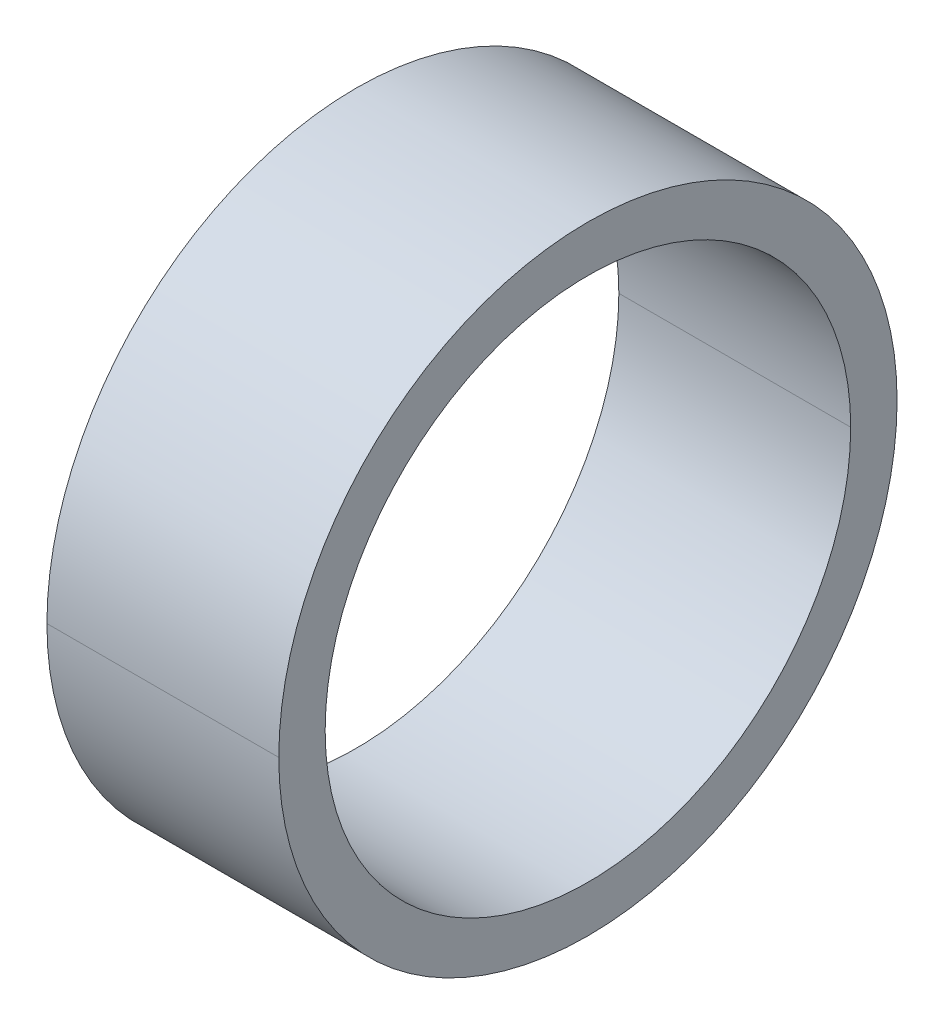
ISO-10303-21;
HEADER;
FILE_DESCRIPTION(('STEP AP214'),'2;1');
FILE_NAME('part.step','',(''),(''),'','','');
FILE_SCHEMA(('AUTOMOTIVE_DESIGN { 1 0 10303 214 1 1 1 1 }'));
ENDSEC;
DATA;
#1=APPLICATION_CONTEXT('core data for automotive mechanical design processes');
#2=APPLICATION_PROTOCOL_DEFINITION('international standard','automotive_design',2000,#1);
#3=PRODUCT_CONTEXT('',#1,'mechanical');
#4=PRODUCT('Part','Part','',(#3));
#5=PRODUCT_RELATED_PRODUCT_CATEGORY('part','',(#4));
#6=PRODUCT_DEFINITION_FORMATION('','',#4);
#7=PRODUCT_DEFINITION_CONTEXT('part definition',#1,'design');
#8=PRODUCT_DEFINITION('design','',#6,#7);
#9=PRODUCT_DEFINITION_SHAPE('','',#8);
#10=(LENGTH_UNIT() NAMED_UNIT(*) SI_UNIT(.MILLI.,.METRE.));
#11=(NAMED_UNIT(*) PLANE_ANGLE_UNIT() SI_UNIT($,.RADIAN.));
#12=(NAMED_UNIT(*) SI_UNIT($,.STERADIAN.) SOLID_ANGLE_UNIT());
#13=UNCERTAINTY_MEASURE_WITH_UNIT(LENGTH_MEASURE(1.E-05),#10,'distance_accuracy_value','');
#14=(GEOMETRIC_REPRESENTATION_CONTEXT(3) GLOBAL_UNCERTAINTY_ASSIGNED_CONTEXT((#13)) GLOBAL_UNIT_ASSIGNED_CONTEXT((#10,
#11,#12)) REPRESENTATION_CONTEXT('',''));
#15=CARTESIAN_POINT('',(0.,0.,0.));
#16=DIRECTION('',(0.,0.,1.));
#17=DIRECTION('',(1.,0.,0.));
#18=AXIS2_PLACEMENT_3D('',#15,#16,#17);
#19=CARTESIAN_POINT('',(19.05,0.,0.));
#20=DIRECTION('',(-1.,0.,0.));
#21=DIRECTION('',(0.,0.,1.));
#22=AXIS2_PLACEMENT_3D('',#19,#20,#21);
#23=CYLINDRICAL_SURFACE('',#22,43.18);
#24=DIRECTION('',(-1.,0.,0.));
#25=VECTOR('',#24,1.);
#26=CARTESIAN_POINT('',(19.05,0.,-43.18));
#27=LINE('',#26,#25);
#28=CARTESIAN_POINT('',(19.05,0.,-43.18));
#29=VERTEX_POINT('',#28);
#30=CARTESIAN_POINT('',(-19.05,0.,-43.18));
#31=VERTEX_POINT('',#30);
#32=EDGE_CURVE('E107',#29,#31,#27,.T.);
#33=ORIENTED_EDGE('',*,*,#32,.F.);
#34=CARTESIAN_POINT('',(19.05,0.,0.));
#35=DIRECTION('',(1.,0.,0.));
#36=DIRECTION('',(0.,0.,-1.));
#37=AXIS2_PLACEMENT_3D('',#34,#35,#36);
#38=CIRCLE('',#37,43.18);
#39=CARTESIAN_POINT('',(19.05,0.,43.18));
#40=VERTEX_POINT('',#39);
#41=EDGE_CURVE('E76',#29,#40,#38,.T.);
#42=ORIENTED_EDGE('',*,*,#41,.T.);
#43=DIRECTION('',(-1.,0.,0.));
#44=VECTOR('',#43,1.);
#45=CARTESIAN_POINT('',(19.05,0.,43.18));
#46=LINE('',#45,#44);
#47=CARTESIAN_POINT('',(-19.05,0.,43.18));
#48=VERTEX_POINT('',#47);
#49=EDGE_CURVE('E89',#40,#48,#46,.T.);
#50=ORIENTED_EDGE('',*,*,#49,.T.);
#51=CARTESIAN_POINT('',(-19.05,0.,0.));
#52=DIRECTION('',(1.,0.,0.));
#53=DIRECTION('',(0.,0.,-1.));
#54=AXIS2_PLACEMENT_3D('',#51,#52,#53);
#55=CIRCLE('',#54,43.18);
#56=EDGE_CURVE('E11',#31,#48,#55,.T.);
#57=ORIENTED_EDGE('',*,*,#56,.F.);
#58=EDGE_LOOP('',(#33,#42,#50,#57));
#59=FACE_BOUND('',#58,.T.);
#60=ADVANCED_FACE('F17',(#59),#23,.F.);
#61=CARTESIAN_POINT('',(19.05,0.,0.));
#62=DIRECTION('',(-1.,0.,0.));
#63=DIRECTION('',(0.,0.,1.));
#64=AXIS2_PLACEMENT_3D('',#61,#62,#63);
#65=CYLINDRICAL_SURFACE('',#64,50.8);
#66=DIRECTION('',(-1.,0.,0.));
#67=VECTOR('',#66,1.);
#68=CARTESIAN_POINT('',(19.05,0.,-50.8));
#69=LINE('',#68,#67);
#70=CARTESIAN_POINT('',(19.05,0.,-50.8));
#71=VERTEX_POINT('',#70);
#72=CARTESIAN_POINT('',(-19.05,0.,-50.8));
#73=VERTEX_POINT('',#72);
#74=EDGE_CURVE('E80',#71,#73,#69,.T.);
#75=ORIENTED_EDGE('',*,*,#74,.F.);
#76=CARTESIAN_POINT('',(19.05,0.,0.));
#77=DIRECTION('',(1.,0.,0.));
#78=DIRECTION('',(0.,0.,-1.));
#79=AXIS2_PLACEMENT_3D('',#76,#77,#78);
#80=CIRCLE('',#79,50.8);
#81=CARTESIAN_POINT('',(19.05,0.,50.8));
#82=VERTEX_POINT('',#81);
#83=EDGE_CURVE('E70',#82,#71,#80,.T.);
#84=ORIENTED_EDGE('',*,*,#83,.F.);
#85=DIRECTION('',(-1.,0.,0.));
#86=VECTOR('',#85,1.);
#87=CARTESIAN_POINT('',(19.05,0.,50.8));
#88=LINE('',#87,#86);
#89=CARTESIAN_POINT('',(-19.05,0.,50.8));
#90=VERTEX_POINT('',#89);
#91=EDGE_CURVE('E77',#82,#90,#88,.T.);
#92=ORIENTED_EDGE('',*,*,#91,.T.);
#93=CARTESIAN_POINT('',(-19.05,0.,0.));
#94=DIRECTION('',(1.,0.,0.));
#95=DIRECTION('',(0.,0.,-1.));
#96=AXIS2_PLACEMENT_3D('',#93,#94,#95);
#97=CIRCLE('',#96,50.8);
#98=EDGE_CURVE('E25',#90,#73,#97,.T.);
#99=ORIENTED_EDGE('',*,*,#98,.T.);
#100=EDGE_LOOP('',(#75,#84,#92,#99));
#101=FACE_BOUND('',#100,.T.);
#102=ADVANCED_FACE('F81',(#101),#65,.T.);
#103=CARTESIAN_POINT('',(-19.05,0.,0.));
#104=DIRECTION('',(1.,0.,0.));
#105=DIRECTION('',(0.,1.,0.));
#106=AXIS2_PLACEMENT_3D('',#103,#104,#105);
#107=PLANE('',#106);
#108=CARTESIAN_POINT('',(-19.05,0.,0.));
#109=DIRECTION('',(1.,0.,0.));
#110=DIRECTION('',(0.,0.,-1.));
#111=AXIS2_PLACEMENT_3D('',#108,#109,#110);
#112=CIRCLE('',#111,43.18);
#113=EDGE_CURVE('E97',#48,#31,#112,.T.);
#114=ORIENTED_EDGE('',*,*,#113,.T.);
#115=ORIENTED_EDGE('',*,*,#56,.T.);
#116=EDGE_LOOP('',(#114,#115));
#117=FACE_BOUND('',#116,.T.);
#118=ORIENTED_EDGE('',*,*,#98,.F.);
#119=CARTESIAN_POINT('',(-19.05,0.,0.));
#120=DIRECTION('',(1.,0.,0.));
#121=DIRECTION('',(0.,0.,-1.));
#122=AXIS2_PLACEMENT_3D('',#119,#120,#121);
#123=CIRCLE('',#122,50.8);
#124=EDGE_CURVE('E85',#73,#90,#123,.T.);
#125=ORIENTED_EDGE('',*,*,#124,.F.);
#126=EDGE_LOOP('',(#118,#125));
#127=FACE_BOUND('',#126,.T.);
#128=ADVANCED_FACE('F123',(#117,#127),#107,.F.);
#129=CARTESIAN_POINT('',(19.05,0.,0.));
#130=DIRECTION('',(1.,0.,0.));
#131=DIRECTION('',(0.,1.,0.));
#132=AXIS2_PLACEMENT_3D('',#129,#130,#131);
#133=PLANE('',#132);
#134=CARTESIAN_POINT('',(19.05,0.,0.));
#135=DIRECTION('',(1.,0.,0.));
#136=DIRECTION('',(0.,0.,-1.));
#137=AXIS2_PLACEMENT_3D('',#134,#135,#136);
#138=CIRCLE('',#137,43.18);
#139=EDGE_CURVE('E103',#40,#29,#138,.T.);
#140=ORIENTED_EDGE('',*,*,#139,.F.);
#141=ORIENTED_EDGE('',*,*,#41,.F.);
#142=EDGE_LOOP('',(#140,#141));
#143=FACE_BOUND('',#142,.T.);
#144=ORIENTED_EDGE('',*,*,#83,.T.);
#145=CARTESIAN_POINT('',(19.05,0.,0.));
#146=DIRECTION('',(1.,0.,0.));
#147=DIRECTION('',(0.,0.,-1.));
#148=AXIS2_PLACEMENT_3D('',#145,#146,#147);
#149=CIRCLE('',#148,50.8);
#150=EDGE_CURVE('E73',#71,#82,#149,.T.);
#151=ORIENTED_EDGE('',*,*,#150,.T.);
#152=EDGE_LOOP('',(#144,#151));
#153=FACE_BOUND('',#152,.T.);
#154=ADVANCED_FACE('F71',(#143,#153),#133,.T.);
#155=CARTESIAN_POINT('',(19.05,0.,0.));
#156=DIRECTION('',(-1.,0.,0.));
#157=DIRECTION('',(0.,0.,1.));
#158=AXIS2_PLACEMENT_3D('',#155,#156,#157);
#159=CYLINDRICAL_SURFACE('',#158,50.8);
#160=ORIENTED_EDGE('',*,*,#150,.F.);
#161=ORIENTED_EDGE('',*,*,#74,.T.);
#162=ORIENTED_EDGE('',*,*,#124,.T.);
#163=ORIENTED_EDGE('',*,*,#91,.F.);
#164=EDGE_LOOP('',(#160,#161,#162,#163));
#165=FACE_BOUND('',#164,.T.);
#166=ADVANCED_FACE('F87',(#165),#159,.T.);
#167=CARTESIAN_POINT('',(19.05,0.,0.));
#168=DIRECTION('',(-1.,0.,0.));
#169=DIRECTION('',(0.,0.,1.));
#170=AXIS2_PLACEMENT_3D('',#167,#168,#169);
#171=CYLINDRICAL_SURFACE('',#170,43.18);
#172=ORIENTED_EDGE('',*,*,#139,.T.);
#173=ORIENTED_EDGE('',*,*,#32,.T.);
#174=ORIENTED_EDGE('',*,*,#113,.F.);
#175=ORIENTED_EDGE('',*,*,#49,.F.);
#176=EDGE_LOOP('',(#172,#173,#174,#175));
#177=FACE_BOUND('',#176,.T.);
#178=ADVANCED_FACE('F120',(#177),#171,.F.);
#179=CLOSED_SHELL('',(#60,#102,#128,#154,#166,#178));
#180=MANIFOLD_SOLID_BREP('B1',#179);
#181=ADVANCED_BREP_SHAPE_REPRESENTATION('',(#18,#180),#14);
#182=SHAPE_DEFINITION_REPRESENTATION(#9,#181);
ENDSEC;
END-ISO-10303-21;
